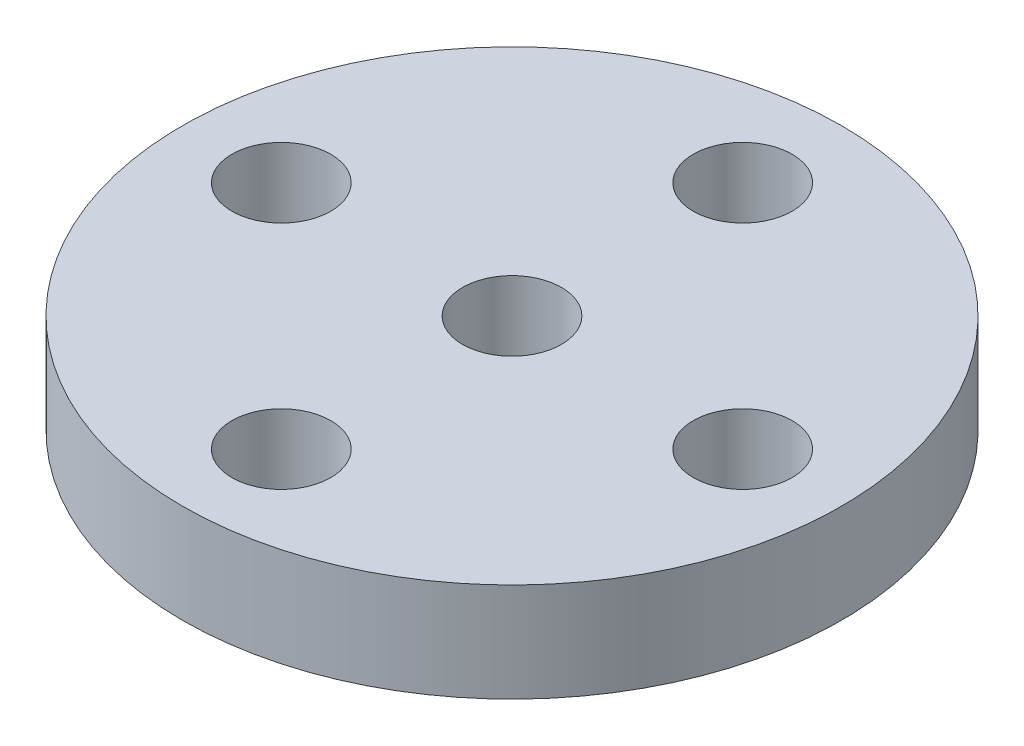
ISO-10303-21;
HEADER;
FILE_DESCRIPTION(('STEP AP214'),'2;1');
FILE_NAME('part.step','',(''),(''),'','','');
FILE_SCHEMA(('AUTOMOTIVE_DESIGN { 1 0 10303 214 1 1 1 1 }'));
ENDSEC;
DATA;
#1=APPLICATION_CONTEXT('core data for automotive mechanical design processes');
#2=APPLICATION_PROTOCOL_DEFINITION('international standard','automotive_design',2000,#1);
#3=PRODUCT_CONTEXT('',#1,'mechanical');
#4=PRODUCT('Part','Part','',(#3));
#5=PRODUCT_RELATED_PRODUCT_CATEGORY('part','',(#4));
#6=PRODUCT_DEFINITION_FORMATION('','',#4);
#7=PRODUCT_DEFINITION_CONTEXT('part definition',#1,'design');
#8=PRODUCT_DEFINITION('design','',#6,#7);
#9=PRODUCT_DEFINITION_SHAPE('','',#8);
#10=(LENGTH_UNIT() NAMED_UNIT(*) SI_UNIT(.MILLI.,.METRE.));
#11=(NAMED_UNIT(*) PLANE_ANGLE_UNIT() SI_UNIT($,.RADIAN.));
#12=(NAMED_UNIT(*) SI_UNIT($,.STERADIAN.) SOLID_ANGLE_UNIT());
#13=UNCERTAINTY_MEASURE_WITH_UNIT(LENGTH_MEASURE(1.E-05),#10,'distance_accuracy_value','');
#14=(GEOMETRIC_REPRESENTATION_CONTEXT(3) GLOBAL_UNCERTAINTY_ASSIGNED_CONTEXT((#13)) GLOBAL_UNIT_ASSIGNED_CONTEXT((#10,
#11,#12)) REPRESENTATION_CONTEXT('',''));
#15=CARTESIAN_POINT('',(0.,0.,0.));
#16=DIRECTION('',(0.,0.,1.));
#17=DIRECTION('',(1.,0.,0.));
#18=AXIS2_PLACEMENT_3D('',#15,#16,#17);
#19=CARTESIAN_POINT('',(0.,3.,0.));
#20=DIRECTION('',(0.,1.,0.));
#21=DIRECTION('',(0.,0.,1.));
#22=AXIS2_PLACEMENT_3D('',#19,#20,#21);
#23=PLANE('',#22);
#24=CARTESIAN_POINT('',(0.,3.,7.));
#25=DIRECTION('',(0.,1.,0.));
#26=DIRECTION('',(0.,0.,-1.));
#27=AXIS2_PLACEMENT_3D('',#24,#25,#26);
#28=CIRCLE('',#27,1.5);
#29=CARTESIAN_POINT('',(0.,3.,5.5));
#30=VERTEX_POINT('',#29);
#31=EDGE_CURVE('E76',#30,#30,#28,.T.);
#32=ORIENTED_EDGE('',*,*,#31,.F.);
#33=EDGE_LOOP('',(#32));
#34=FACE_BOUND('',#33,.T.);
#35=CARTESIAN_POINT('',(7.,3.,0.));
#36=DIRECTION('',(0.,1.,0.));
#37=DIRECTION('',(0.,0.,1.));
#38=AXIS2_PLACEMENT_3D('',#35,#36,#37);
#39=CIRCLE('',#38,1.5);
#40=CARTESIAN_POINT('',(7.,3.,1.5));
#41=VERTEX_POINT('',#40);
#42=EDGE_CURVE('E60',#41,#41,#39,.T.);
#43=ORIENTED_EDGE('',*,*,#42,.F.);
#44=EDGE_LOOP('',(#43));
#45=FACE_BOUND('',#44,.T.);
#46=CARTESIAN_POINT('',(0.,3.,0.));
#47=DIRECTION('',(0.,1.,0.));
#48=DIRECTION('',(0.,0.,1.));
#49=AXIS2_PLACEMENT_3D('',#46,#47,#48);
#50=CIRCLE('',#49,10.);
#51=CARTESIAN_POINT('',(0.,3.,10.));
#52=VERTEX_POINT('',#51);
#53=EDGE_CURVE('E10',#52,#52,#50,.T.);
#54=ORIENTED_EDGE('',*,*,#53,.T.);
#55=EDGE_LOOP('',(#54));
#56=FACE_BOUND('',#55,.T.);
#57=CARTESIAN_POINT('',(0.,3.,-7.));
#58=DIRECTION('',(0.,1.,0.));
#59=DIRECTION('',(0.,0.,1.));
#60=AXIS2_PLACEMENT_3D('',#57,#58,#59);
#61=CIRCLE('',#60,1.5);
#62=CARTESIAN_POINT('',(0.,3.,-5.5));
#63=VERTEX_POINT('',#62);
#64=EDGE_CURVE('E54',#63,#63,#61,.T.);
#65=ORIENTED_EDGE('',*,*,#64,.F.);
#66=EDGE_LOOP('',(#65));
#67=FACE_BOUND('',#66,.T.);
#68=CARTESIAN_POINT('',(0.,3.,0.));
#69=DIRECTION('',(0.,1.,0.));
#70=DIRECTION('',(0.,0.,1.));
#71=AXIS2_PLACEMENT_3D('',#68,#69,#70);
#72=CIRCLE('',#71,1.5);
#73=CARTESIAN_POINT('',(0.,3.,1.5));
#74=VERTEX_POINT('',#73);
#75=EDGE_CURVE('E68',#74,#74,#72,.T.);
#76=ORIENTED_EDGE('',*,*,#75,.F.);
#77=EDGE_LOOP('',(#76));
#78=FACE_BOUND('',#77,.T.);
#79=CARTESIAN_POINT('',(-7.,3.,0.));
#80=DIRECTION('',(0.,1.,0.));
#81=DIRECTION('',(0.,0.,-1.));
#82=AXIS2_PLACEMENT_3D('',#79,#80,#81);
#83=CIRCLE('',#82,1.5);
#84=CARTESIAN_POINT('',(-7.,3.,-1.5));
#85=VERTEX_POINT('',#84);
#86=EDGE_CURVE('E84',#85,#85,#83,.T.);
#87=ORIENTED_EDGE('',*,*,#86,.F.);
#88=EDGE_LOOP('',(#87));
#89=FACE_BOUND('',#88,.T.);
#90=ADVANCED_FACE('F41',(#34,#45,#56,#67,#78,#89),#23,.T.);
#91=CARTESIAN_POINT('',(0.,0.,0.));
#92=DIRECTION('',(0.,1.,0.));
#93=DIRECTION('',(0.,0.,1.));
#94=AXIS2_PLACEMENT_3D('',#91,#92,#93);
#95=PLANE('',#94);
#96=CARTESIAN_POINT('',(0.,0.,0.));
#97=DIRECTION('',(0.,1.,0.));
#98=DIRECTION('',(0.,0.,1.));
#99=AXIS2_PLACEMENT_3D('',#96,#97,#98);
#100=CIRCLE('',#99,10.);
#101=CARTESIAN_POINT('',(0.,0.,10.));
#102=VERTEX_POINT('',#101);
#103=EDGE_CURVE('E45',#102,#102,#100,.T.);
#104=ORIENTED_EDGE('',*,*,#103,.F.);
#105=EDGE_LOOP('',(#104));
#106=FACE_BOUND('',#105,.T.);
#107=CARTESIAN_POINT('',(0.,0.,-7.));
#108=DIRECTION('',(0.,1.,0.));
#109=DIRECTION('',(0.,0.,1.));
#110=AXIS2_PLACEMENT_3D('',#107,#108,#109);
#111=CIRCLE('',#110,1.5);
#112=CARTESIAN_POINT('',(0.,0.,-5.5));
#113=VERTEX_POINT('',#112);
#114=EDGE_CURVE('E56',#113,#113,#111,.T.);
#115=ORIENTED_EDGE('',*,*,#114,.T.);
#116=EDGE_LOOP('',(#115));
#117=FACE_BOUND('',#116,.T.);
#118=CARTESIAN_POINT('',(7.,0.,0.));
#119=DIRECTION('',(0.,1.,0.));
#120=DIRECTION('',(0.,0.,1.));
#121=AXIS2_PLACEMENT_3D('',#118,#119,#120);
#122=CIRCLE('',#121,1.5);
#123=CARTESIAN_POINT('',(7.,0.,1.5));
#124=VERTEX_POINT('',#123);
#125=EDGE_CURVE('E64',#124,#124,#122,.T.);
#126=ORIENTED_EDGE('',*,*,#125,.T.);
#127=EDGE_LOOP('',(#126));
#128=FACE_BOUND('',#127,.T.);
#129=CARTESIAN_POINT('',(0.,0.,0.));
#130=DIRECTION('',(0.,1.,0.));
#131=DIRECTION('',(0.,0.,1.));
#132=AXIS2_PLACEMENT_3D('',#129,#130,#131);
#133=CIRCLE('',#132,1.5);
#134=CARTESIAN_POINT('',(0.,0.,1.5));
#135=VERTEX_POINT('',#134);
#136=EDGE_CURVE('E72',#135,#135,#133,.T.);
#137=ORIENTED_EDGE('',*,*,#136,.T.);
#138=EDGE_LOOP('',(#137));
#139=FACE_BOUND('',#138,.T.);
#140=CARTESIAN_POINT('',(0.,0.,7.));
#141=DIRECTION('',(0.,1.,0.));
#142=DIRECTION('',(0.,0.,-1.));
#143=AXIS2_PLACEMENT_3D('',#140,#141,#142);
#144=CIRCLE('',#143,1.5);
#145=CARTESIAN_POINT('',(0.,0.,5.5));
#146=VERTEX_POINT('',#145);
#147=EDGE_CURVE('E80',#146,#146,#144,.T.);
#148=ORIENTED_EDGE('',*,*,#147,.T.);
#149=EDGE_LOOP('',(#148));
#150=FACE_BOUND('',#149,.T.);
#151=CARTESIAN_POINT('',(-7.,0.,0.));
#152=DIRECTION('',(0.,1.,0.));
#153=DIRECTION('',(0.,0.,-1.));
#154=AXIS2_PLACEMENT_3D('',#151,#152,#153);
#155=CIRCLE('',#154,1.5);
#156=CARTESIAN_POINT('',(-7.,0.,-1.5));
#157=VERTEX_POINT('',#156);
#158=EDGE_CURVE('E88',#157,#157,#155,.T.);
#159=ORIENTED_EDGE('',*,*,#158,.T.);
#160=EDGE_LOOP('',(#159));
#161=FACE_BOUND('',#160,.T.);
#162=ADVANCED_FACE('F100',(#106,#117,#128,#139,#150,#161),#95,.F.);
#163=CARTESIAN_POINT('',(0.,3.,0.));
#164=DIRECTION('',(0.,-1.,0.));
#165=DIRECTION('',(0.,0.,-1.));
#166=AXIS2_PLACEMENT_3D('',#163,#164,#165);
#167=CYLINDRICAL_SURFACE('',#166,10.);
#168=ORIENTED_EDGE('',*,*,#53,.F.);
#169=EDGE_LOOP('',(#168));
#170=FACE_BOUND('',#169,.T.);
#171=ORIENTED_EDGE('',*,*,#103,.T.);
#172=EDGE_LOOP('',(#171));
#173=FACE_BOUND('',#172,.T.);
#174=ADVANCED_FACE('F43',(#170,#173),#167,.T.);
#175=CARTESIAN_POINT('',(0.,3.,-7.));
#176=DIRECTION('',(0.,-1.,0.));
#177=DIRECTION('',(0.,0.,-1.));
#178=AXIS2_PLACEMENT_3D('',#175,#176,#177);
#179=CYLINDRICAL_SURFACE('',#178,1.5);
#180=ORIENTED_EDGE('',*,*,#64,.T.);
#181=EDGE_LOOP('',(#180));
#182=FACE_BOUND('',#181,.T.);
#183=ORIENTED_EDGE('',*,*,#114,.F.);
#184=EDGE_LOOP('',(#183));
#185=FACE_BOUND('',#184,.T.);
#186=ADVANCED_FACE('F110',(#182,#185),#179,.F.);
#187=CARTESIAN_POINT('',(7.,3.,0.));
#188=DIRECTION('',(0.,-1.,0.));
#189=DIRECTION('',(0.,0.,-1.));
#190=AXIS2_PLACEMENT_3D('',#187,#188,#189);
#191=CYLINDRICAL_SURFACE('',#190,1.5);
#192=ORIENTED_EDGE('',*,*,#42,.T.);
#193=EDGE_LOOP('',(#192));
#194=FACE_BOUND('',#193,.T.);
#195=ORIENTED_EDGE('',*,*,#125,.F.);
#196=EDGE_LOOP('',(#195));
#197=FACE_BOUND('',#196,.T.);
#198=ADVANCED_FACE('F113',(#194,#197),#191,.F.);
#199=CARTESIAN_POINT('',(0.,3.,0.));
#200=DIRECTION('',(0.,-1.,0.));
#201=DIRECTION('',(0.,0.,-1.));
#202=AXIS2_PLACEMENT_3D('',#199,#200,#201);
#203=CYLINDRICAL_SURFACE('',#202,1.5);
#204=ORIENTED_EDGE('',*,*,#75,.T.);
#205=EDGE_LOOP('',(#204));
#206=FACE_BOUND('',#205,.T.);
#207=ORIENTED_EDGE('',*,*,#136,.F.);
#208=EDGE_LOOP('',(#207));
#209=FACE_BOUND('',#208,.T.);
#210=ADVANCED_FACE('F117',(#206,#209),#203,.F.);
#211=CARTESIAN_POINT('',(0.,3.,7.));
#212=DIRECTION('',(0.,-1.,0.));
#213=DIRECTION('',(0.,0.,-1.));
#214=AXIS2_PLACEMENT_3D('',#211,#212,#213);
#215=CYLINDRICAL_SURFACE('',#214,1.5);
#216=ORIENTED_EDGE('',*,*,#31,.T.);
#217=EDGE_LOOP('',(#216));
#218=FACE_BOUND('',#217,.T.);
#219=ORIENTED_EDGE('',*,*,#147,.F.);
#220=EDGE_LOOP('',(#219));
#221=FACE_BOUND('',#220,.T.);
#222=ADVANCED_FACE('F121',(#218,#221),#215,.F.);
#223=CARTESIAN_POINT('',(-7.,3.,0.));
#224=DIRECTION('',(0.,-1.,0.));
#225=DIRECTION('',(0.,0.,-1.));
#226=AXIS2_PLACEMENT_3D('',#223,#224,#225);
#227=CYLINDRICAL_SURFACE('',#226,1.5);
#228=ORIENTED_EDGE('',*,*,#86,.T.);
#229=EDGE_LOOP('',(#228));
#230=FACE_BOUND('',#229,.T.);
#231=ORIENTED_EDGE('',*,*,#158,.F.);
#232=EDGE_LOOP('',(#231));
#233=FACE_BOUND('',#232,.T.);
#234=ADVANCED_FACE('F96',(#230,#233),#227,.F.);
#235=CLOSED_SHELL('',(#90,#162,#174,#186,#198,#210,#222,#234));
#236=MANIFOLD_SOLID_BREP('B2',#235);
#237=ADVANCED_BREP_SHAPE_REPRESENTATION('',(#18,#236),#14);
#238=SHAPE_DEFINITION_REPRESENTATION(#9,#237);
ENDSEC;
END-ISO-10303-21;
